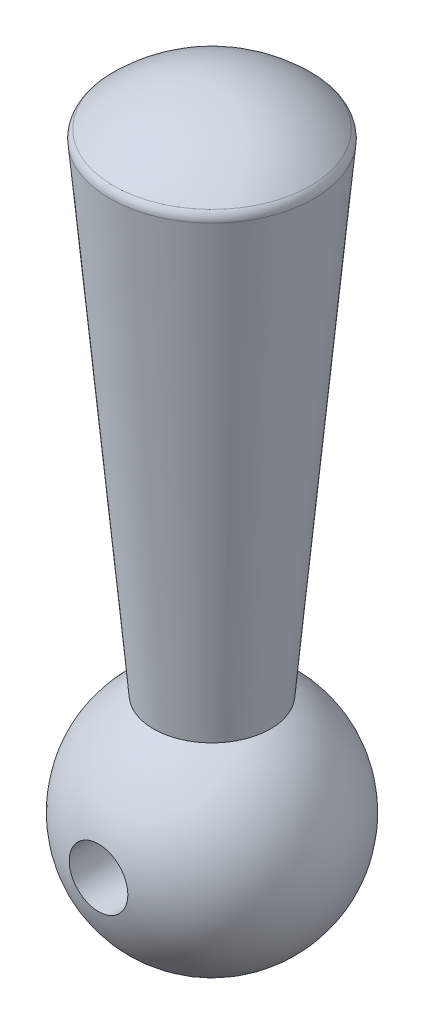
ISO-10303-21;
HEADER;
FILE_DESCRIPTION(('STEP AP214'),'2;1');
FILE_NAME('part.step','',(''),(''),'','','');
FILE_SCHEMA(('AUTOMOTIVE_DESIGN { 1 0 10303 214 1 1 1 1 }'));
ENDSEC;
DATA;
#1=APPLICATION_CONTEXT('core data for automotive mechanical design processes');
#2=APPLICATION_PROTOCOL_DEFINITION('international standard','automotive_design',2000,#1);
#3=PRODUCT_CONTEXT('',#1,'mechanical');
#4=PRODUCT('Part','Part','',(#3));
#5=PRODUCT_RELATED_PRODUCT_CATEGORY('part','',(#4));
#6=PRODUCT_DEFINITION_FORMATION('','',#4);
#7=PRODUCT_DEFINITION_CONTEXT('part definition',#1,'design');
#8=PRODUCT_DEFINITION('design','',#6,#7);
#9=PRODUCT_DEFINITION_SHAPE('','',#8);
#10=(LENGTH_UNIT() NAMED_UNIT(*) SI_UNIT(.MILLI.,.METRE.));
#11=(NAMED_UNIT(*) PLANE_ANGLE_UNIT() SI_UNIT($,.RADIAN.));
#12=(NAMED_UNIT(*) SI_UNIT($,.STERADIAN.) SOLID_ANGLE_UNIT());
#13=UNCERTAINTY_MEASURE_WITH_UNIT(LENGTH_MEASURE(1.E-05),#10,'distance_accuracy_value','');
#14=(GEOMETRIC_REPRESENTATION_CONTEXT(3) GLOBAL_UNCERTAINTY_ASSIGNED_CONTEXT((#13)) GLOBAL_UNIT_ASSIGNED_CONTEXT((#10,
#11,#12)) REPRESENTATION_CONTEXT('',''));
#15=CARTESIAN_POINT('',(0.,0.,0.));
#16=DIRECTION('',(0.,0.,1.));
#17=DIRECTION('',(1.,0.,0.));
#18=AXIS2_PLACEMENT_3D('',#15,#16,#17);
#19=CARTESIAN_POINT('',(0.,0.,-2.));
#20=DIRECTION('',(0.,0.,1.));
#21=DIRECTION('',(1.,0.,0.));
#22=AXIS2_PLACEMENT_3D('',#19,#20,#21);
#23=CYLINDRICAL_SURFACE('',#22,0.5);
#24=CARTESIAN_POINT('',(0.,0.,-1.93649167310371));
#25=DIRECTION('',(0.,0.,1.));
#26=DIRECTION('',(1.,0.,0.));
#27=AXIS2_PLACEMENT_3D('',#24,#25,#26);
#28=CIRCLE('',#27,0.5);
#29=CARTESIAN_POINT('',(0.5,0.,-1.93649167310371));
#30=VERTEX_POINT('',#29);
#31=EDGE_CURVE('E19',#30,#30,#28,.T.);
#32=ORIENTED_EDGE('',*,*,#31,.F.);
#33=EDGE_LOOP('',(#32));
#34=FACE_BOUND('',#33,.T.);
#35=CARTESIAN_POINT('',(0.,0.,1.93649167310371));
#36=DIRECTION('',(0.,0.,1.));
#37=DIRECTION('',(1.,0.,0.));
#38=AXIS2_PLACEMENT_3D('',#35,#36,#37);
#39=CIRCLE('',#38,0.5);
#40=CARTESIAN_POINT('',(0.5,0.,1.93649167310371));
#41=VERTEX_POINT('',#40);
#42=EDGE_CURVE('E43',#41,#41,#39,.F.);
#43=ORIENTED_EDGE('',*,*,#42,.F.);
#44=EDGE_LOOP('',(#43));
#45=FACE_BOUND('',#44,.T.);
#46=ADVANCED_FACE('F16',(#34,#45),#23,.F.);
#47=CARTESIAN_POINT('',(0.,8.38008618728082,0.));
#48=DIRECTION('',(-1.,0.,0.));
#49=DIRECTION('',(0.,1.,0.));
#50=AXIS2_PLACEMENT_3D('',#47,#48,#49);
#51=SPHERICAL_SURFACE('',#50,2.4065508734875);
#52=CARTESIAN_POINT('',(0.,10.1009470503154,0.));
#53=DIRECTION('',(0.,-1.,0.));
#54=DIRECTION('',(1.,0.,0.));
#55=AXIS2_PLACEMENT_3D('',#52,#53,#54);
#56=CIRCLE('',#55,1.68229753514633);
#57=CARTESIAN_POINT('',(1.68229753514633,10.1009470503154,0.));
#58=VERTEX_POINT('',#57);
#59=EDGE_CURVE('E47',#58,#58,#56,.T.);
#60=ORIENTED_EDGE('',*,*,#59,.F.);
#61=EDGE_LOOP('',(#60));
#62=FACE_BOUND('',#61,.T.);
#63=ADVANCED_FACE('F35',(#62),#51,.T.);
#64=CARTESIAN_POINT('',(0.,0.,0.));
#65=DIRECTION('',(-1.,0.,0.));
#66=DIRECTION('',(0.,1.,0.));
#67=AXIS2_PLACEMENT_3D('',#64,#65,#66);
#68=SPHERICAL_SURFACE('',#67,2.);
#69=CARTESIAN_POINT('',(2.,0.,0.));
#70=VERTEX_POINT('',#69);
#71=VERTEX_LOOP('',#70);
#72=FACE_BOUND('',#71,.T.);
#73=CARTESIAN_POINT('',(0.,1.73205080756134,0.));
#74=DIRECTION('',(0.,1.,0.));
#75=DIRECTION('',(-1.,0.,0.));
#76=AXIS2_PLACEMENT_3D('',#73,#74,#75);
#77=CIRCLE('',#76,1.0000000000028);
#78=CARTESIAN_POINT('',(-1.00000000000281,1.73205080756134,0.));
#79=VERTEX_POINT('',#78);
#80=EDGE_CURVE('E25',#79,#79,#77,.T.);
#81=ORIENTED_EDGE('',*,*,#80,.F.);
#82=EDGE_LOOP('',(#81));
#83=FACE_BOUND('',#82,.T.);
#84=CARTESIAN_POINT('',(-2.,0.,0.));
#85=VERTEX_POINT('',#84);
#86=VERTEX_LOOP('',#85);
#87=FACE_BOUND('',#86,.T.);
#88=ORIENTED_EDGE('',*,*,#42,.T.);
#89=EDGE_LOOP('',(#88));
#90=FACE_BOUND('',#89,.T.);
#91=ORIENTED_EDGE('',*,*,#31,.T.);
#92=EDGE_LOOP('',(#91));
#93=FACE_BOUND('',#92,.T.);
#94=ADVANCED_FACE('F31',(#72,#83,#87,#90,#93),#68,.T.);
#95=CARTESIAN_POINT('',(0.,9.95793234142281,0.));
#96=DIRECTION('',(0.,-1.,0.));
#97=DIRECTION('',(1.,0.,0.));
#98=AXIS2_PLACEMENT_3D('',#95,#96,#97);
#99=TOROIDAL_SURFACE('',#98,1.54248768913976,0.2);
#100=CARTESIAN_POINT('',(0.,9.93993338533983,0.));
#101=DIRECTION('',(0.,1.,0.));
#102=DIRECTION('',(-1.,0.,0.));
#103=AXIS2_PLACEMENT_3D('',#100,#101,#102);
#104=CIRCLE('',#103,1.74167613654671);
#105=CARTESIAN_POINT('',(-1.74167613654674,9.93993338533983,0.));
#106=VERTEX_POINT('',#105);
#107=EDGE_CURVE('E11',#106,#106,#104,.F.);
#108=ORIENTED_EDGE('',*,*,#107,.F.);
#109=EDGE_LOOP('',(#108));
#110=FACE_BOUND('',#109,.T.);
#111=ORIENTED_EDGE('',*,*,#59,.T.);
#112=EDGE_LOOP('',(#111));
#113=FACE_BOUND('',#112,.T.);
#114=ADVANCED_FACE('F34',(#110,#113),#99,.T.);
#115=CARTESIAN_POINT('',(0.,9.93993338528299,0.));
#116=DIRECTION('',(0.,1.,0.));
#117=DIRECTION('',(-1.,0.,0.));
#118=AXIS2_PLACEMENT_3D('',#115,#116,#117);
#119=CONICAL_SURFACE('',#118,1.74167613654671,0.0901167042018159);
#120=ORIENTED_EDGE('',*,*,#107,.T.);
#121=EDGE_LOOP('',(#120));
#122=FACE_BOUND('',#121,.T.);
#123=ORIENTED_EDGE('',*,*,#80,.T.);
#124=EDGE_LOOP('',(#123));
#125=FACE_BOUND('',#124,.T.);
#126=ADVANCED_FACE('F61',(#122,#125),#119,.T.);
#127=CLOSED_SHELL('',(#46,#63,#94,#114,#126));
#128=MANIFOLD_SOLID_BREP('B1',#127);
#129=ADVANCED_BREP_SHAPE_REPRESENTATION('',(#18,#128),#14);
#130=SHAPE_DEFINITION_REPRESENTATION(#9,#129);
ENDSEC;
END-ISO-10303-21;
